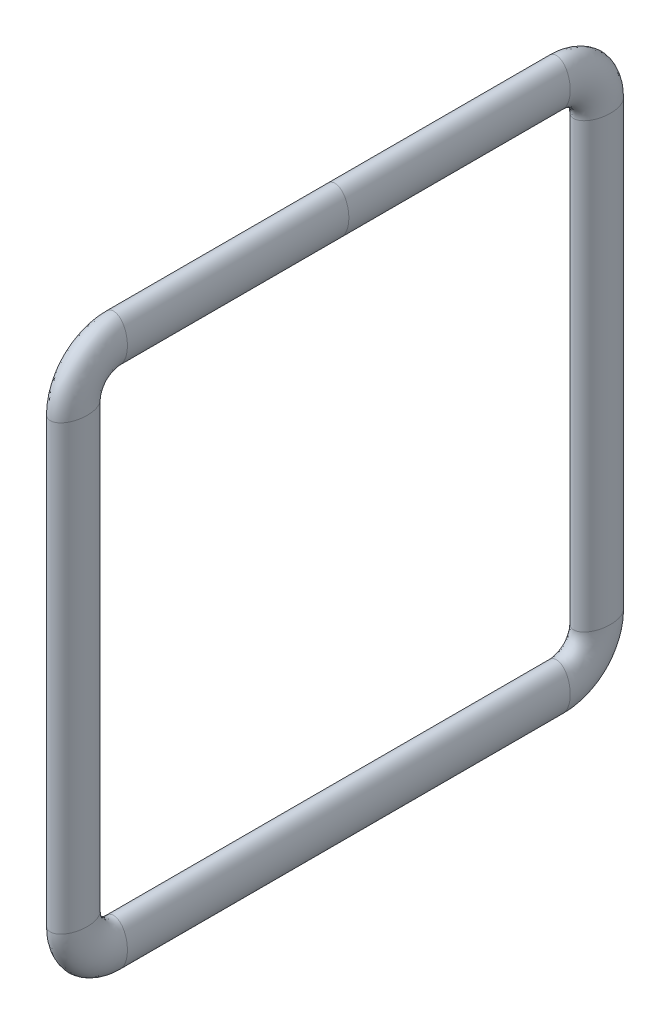
ISO-10303-21;
HEADER;
FILE_DESCRIPTION(('STEP AP214'),'2;1');
FILE_NAME('part.step','',(''),(''),'','','');
FILE_SCHEMA(('AUTOMOTIVE_DESIGN { 1 0 10303 214 1 1 1 1 }'));
ENDSEC;
DATA;
#1=APPLICATION_CONTEXT('core data for automotive mechanical design processes');
#2=APPLICATION_PROTOCOL_DEFINITION('international standard','automotive_design',2000,#1);
#3=PRODUCT_CONTEXT('',#1,'mechanical');
#4=PRODUCT('Part','Part','',(#3));
#5=PRODUCT_RELATED_PRODUCT_CATEGORY('part','',(#4));
#6=PRODUCT_DEFINITION_FORMATION('','',#4);
#7=PRODUCT_DEFINITION_CONTEXT('part definition',#1,'design');
#8=PRODUCT_DEFINITION('design','',#6,#7);
#9=PRODUCT_DEFINITION_SHAPE('','',#8);
#10=(LENGTH_UNIT() NAMED_UNIT(*) SI_UNIT(.MILLI.,.METRE.));
#11=(NAMED_UNIT(*) PLANE_ANGLE_UNIT() SI_UNIT($,.RADIAN.));
#12=(NAMED_UNIT(*) SI_UNIT($,.STERADIAN.) SOLID_ANGLE_UNIT());
#13=UNCERTAINTY_MEASURE_WITH_UNIT(LENGTH_MEASURE(1.E-05),#10,'distance_accuracy_value','');
#14=(GEOMETRIC_REPRESENTATION_CONTEXT(3) GLOBAL_UNCERTAINTY_ASSIGNED_CONTEXT((#13)) GLOBAL_UNIT_ASSIGNED_CONTEXT((#10,
#11,#12)) REPRESENTATION_CONTEXT('',''));
#15=CARTESIAN_POINT('',(0.,0.,0.));
#16=DIRECTION('',(0.,0.,1.));
#17=DIRECTION('',(1.,0.,0.));
#18=AXIS2_PLACEMENT_3D('',#15,#16,#17);
#19=CARTESIAN_POINT('',(0.,24.75,-19.25));
#20=CARTESIAN_POINT('',(0.,24.75,0.));
#21=CARTESIAN_POINT('',(-2.4,24.75,-19.25));
#22=CARTESIAN_POINT('',(-2.4,24.75,0.));
#23=CARTESIAN_POINT('',(-2.4,20.75,-19.25));
#24=CARTESIAN_POINT('',(-2.4,20.75,0.));
#25=CARTESIAN_POINT('',(0.,20.75,-19.25));
#26=CARTESIAN_POINT('',(0.,20.75,0.));
#27=CARTESIAN_POINT('',(2.4,20.75,-19.25));
#28=CARTESIAN_POINT('',(2.4,20.75,0.));
#29=CARTESIAN_POINT('',(2.4,24.75,-19.25));
#30=CARTESIAN_POINT('',(2.4,24.75,0.));
#31=CARTESIAN_POINT('',(0.,24.75,-19.25));
#32=CARTESIAN_POINT('',(0.,24.75,0.));
#33=(BOUNDED_SURFACE() B_SPLINE_SURFACE(3,1,((#19,#20),(#21,#22),(#23,#24),(#25,#26),(#27,#28),
(#29,#30),(#31,#32)),.UNSPECIFIED.,.T.,.F.,.F.) B_SPLINE_SURFACE_WITH_KNOTS((4,3,4),(2,2),(0.,
0.5,1.),(0.,1.),.UNSPECIFIED.) GEOMETRIC_REPRESENTATION_ITEM() RATIONAL_B_SPLINE_SURFACE(((1.,
1.),(0.333333333333333,0.333333333333333),(0.333333333333333,0.333333333333333),(1.,1.),
(0.333333333333333,0.333333333333333),(0.333333333333333,0.333333333333333),(1.,1.))) REPRESENTATION_ITEM('') SURFACE());
#34=CARTESIAN_POINT('',(0.,22.75,0.));
#35=DIRECTION('',(0.,0.,1.));
#36=DIRECTION('',(0.,1.,0.));
#37=AXIS2_PLACEMENT_3D('',#34,#35,#36);
#38=ELLIPSE('',#37,2.,1.2);
#39=CARTESIAN_POINT('',(0.,24.75,0.));
#40=VERTEX_POINT('',#39);
#41=EDGE_CURVE('E65',#40,#40,#38,.T.);
#42=CARTESIAN_POINT('',(0.,22.75,-19.25));
#43=DIRECTION('',(0.,0.,1.));
#44=DIRECTION('',(0.,1.,0.));
#45=AXIS2_PLACEMENT_3D('',#42,#43,#44);
#46=ELLIPSE('',#45,2.,1.2);
#47=CARTESIAN_POINT('',(0.,24.75,-19.25));
#48=VERTEX_POINT('',#47);
#49=EDGE_CURVE('E10',#48,#48,#46,.T.);
#50=ORIENTED_EDGE('',*,*,#41,.F.);
#51=EDGE_LOOP('',(#50));
#52=FACE_BOUND('',#51,.T.);
#53=ORIENTED_EDGE('',*,*,#49,.T.);
#54=EDGE_LOOP('',(#53));
#55=FACE_BOUND('',#54,.T.);
#56=ADVANCED_FACE('F32',(#52,#55),#33,.T.);
#57=CARTESIAN_POINT('',(0.,19.25,-24.75));
#58=CARTESIAN_POINT('',(0.,22.471825406948,-24.75));
#59=CARTESIAN_POINT('',(0.,24.75,-22.471825406948));
#60=CARTESIAN_POINT('',(0.,24.75,-19.25));
#61=CARTESIAN_POINT('',(-2.4,19.25,-24.75));
#62=CARTESIAN_POINT('',(-2.4,22.471825406948,-24.75));
#63=CARTESIAN_POINT('',(-2.4,24.75,-22.471825406948));
#64=CARTESIAN_POINT('',(-2.4,24.75,-19.25));
#65=CARTESIAN_POINT('',(-2.4,19.25,-20.75));
#66=CARTESIAN_POINT('',(-2.4,20.1286796564404,-20.75));
#67=CARTESIAN_POINT('',(-2.4,20.75,-20.1286796564404));
#68=CARTESIAN_POINT('',(-2.4,20.75,-19.25));
#69=CARTESIAN_POINT('',(0.,19.25,-20.75));
#70=CARTESIAN_POINT('',(0.,20.1286796564404,-20.75));
#71=CARTESIAN_POINT('',(0.,20.75,-20.1286796564404));
#72=CARTESIAN_POINT('',(0.,20.75,-19.25));
#73=CARTESIAN_POINT('',(2.4,19.25,-20.75));
#74=CARTESIAN_POINT('',(2.4,20.1286796564404,-20.75));
#75=CARTESIAN_POINT('',(2.4,20.75,-20.1286796564404));
#76=CARTESIAN_POINT('',(2.4,20.75,-19.25));
#77=CARTESIAN_POINT('',(2.4,19.25,-24.75));
#78=CARTESIAN_POINT('',(2.4,22.471825406948,-24.75));
#79=CARTESIAN_POINT('',(2.4,24.75,-22.471825406948));
#80=CARTESIAN_POINT('',(2.4,24.75,-19.25));
#81=CARTESIAN_POINT('',(0.,19.25,-24.75));
#82=CARTESIAN_POINT('',(0.,22.471825406948,-24.75));
#83=CARTESIAN_POINT('',(0.,24.75,-22.471825406948));
#84=CARTESIAN_POINT('',(0.,24.75,-19.25));
#85=(BOUNDED_SURFACE() B_SPLINE_SURFACE(3,3,((#57,#58,#59,#60),(#61,#62,#63,#64),(#65,#66,#67,
#68),(#69,#70,#71,#72),(#73,#74,#75,#76),(#77,#78,#79,#80),(#81,#82,#83,#84)),.UNSPECIFIED.,.T.,
.F.,.F.) B_SPLINE_SURFACE_WITH_KNOTS((4,3,4),(4,4),(0.,0.5,1.),(0.,1.),
.UNSPECIFIED.) GEOMETRIC_REPRESENTATION_ITEM() RATIONAL_B_SPLINE_SURFACE(((1.,0.804737854124365,
0.804737854124365,1.),(0.333333333333333,0.268245951374788,0.268245951374788,0.333333333333333),
(0.333333333333333,0.268245951374788,0.268245951374788,0.333333333333333),(1.,0.804737854124365,
0.804737854124365,1.),(0.333333333333333,0.268245951374788,0.268245951374788,0.333333333333333),
(0.333333333333333,0.268245951374788,0.268245951374788,0.333333333333333),(1.,0.804737854124365,
0.804737854124365,1.))) REPRESENTATION_ITEM('') SURFACE());
#86=CARTESIAN_POINT('',(0.,19.25,-22.75));
#87=DIRECTION('',(0.,1.,0.));
#88=DIRECTION('',(0.,0.,-1.));
#89=AXIS2_PLACEMENT_3D('',#86,#87,#88);
#90=ELLIPSE('',#89,2.,1.2);
#91=CARTESIAN_POINT('',(0.,19.25,-24.75));
#92=VERTEX_POINT('',#91);
#93=EDGE_CURVE('E40',#92,#92,#90,.T.);
#94=ORIENTED_EDGE('',*,*,#49,.F.);
#95=EDGE_LOOP('',(#94));
#96=FACE_BOUND('',#95,.T.);
#97=ORIENTED_EDGE('',*,*,#93,.T.);
#98=EDGE_LOOP('',(#97));
#99=FACE_BOUND('',#98,.T.);
#100=ADVANCED_FACE('F72',(#96,#99),#85,.T.);
#101=CARTESIAN_POINT('',(0.,-19.25,-24.75));
#102=CARTESIAN_POINT('',(0.,19.25,-24.75));
#103=CARTESIAN_POINT('',(-2.4,-19.25,-24.75));
#104=CARTESIAN_POINT('',(-2.4,19.25,-24.75));
#105=CARTESIAN_POINT('',(-2.4,-19.25,-20.75));
#106=CARTESIAN_POINT('',(-2.4,19.25,-20.75));
#107=CARTESIAN_POINT('',(0.,-19.25,-20.75));
#108=CARTESIAN_POINT('',(0.,19.25,-20.75));
#109=CARTESIAN_POINT('',(2.4,-19.25,-20.75));
#110=CARTESIAN_POINT('',(2.4,19.25,-20.75));
#111=CARTESIAN_POINT('',(2.4,-19.25,-24.75));
#112=CARTESIAN_POINT('',(2.4,19.25,-24.75));
#113=CARTESIAN_POINT('',(0.,-19.25,-24.75));
#114=CARTESIAN_POINT('',(0.,19.25,-24.75));
#115=(BOUNDED_SURFACE() B_SPLINE_SURFACE(3,1,((#101,#102),(#103,#104),(#105,#106),(#107,#108),
(#109,#110),(#111,#112),(#113,#114)),.UNSPECIFIED.,.T.,.F.,.F.) B_SPLINE_SURFACE_WITH_KNOTS((4,
3,4),(2,2),(0.,0.5,1.),(0.,1.),
.UNSPECIFIED.) GEOMETRIC_REPRESENTATION_ITEM() RATIONAL_B_SPLINE_SURFACE(((1.,1.),
(0.333333333333333,0.333333333333333),(0.333333333333333,0.333333333333333),(1.,1.),
(0.333333333333333,0.333333333333333),(0.333333333333333,0.333333333333333),(1.,1.))) REPRESENTATION_ITEM('') SURFACE());
#116=CARTESIAN_POINT('',(0.,-19.25,-22.75));
#117=DIRECTION('',(0.,1.,0.));
#118=DIRECTION('',(0.,0.,-1.));
#119=AXIS2_PLACEMENT_3D('',#116,#117,#118);
#120=ELLIPSE('',#119,2.,1.2);
#121=CARTESIAN_POINT('',(0.,-19.25,-24.75));
#122=VERTEX_POINT('',#121);
#123=EDGE_CURVE('E44',#122,#122,#120,.T.);
#124=ORIENTED_EDGE('',*,*,#93,.F.);
#125=EDGE_LOOP('',(#124));
#126=FACE_BOUND('',#125,.T.);
#127=ORIENTED_EDGE('',*,*,#123,.T.);
#128=EDGE_LOOP('',(#127));
#129=FACE_BOUND('',#128,.T.);
#130=ADVANCED_FACE('F76',(#126,#129),#115,.T.);
#131=CARTESIAN_POINT('',(0.,-24.75,-19.25));
#132=CARTESIAN_POINT('',(0.,-24.75,-22.471825406948));
#133=CARTESIAN_POINT('',(0.,-22.471825406948,-24.75));
#134=CARTESIAN_POINT('',(0.,-19.25,-24.75));
#135=CARTESIAN_POINT('',(-2.4,-24.75,-19.25));
#136=CARTESIAN_POINT('',(-2.4,-24.75,-22.471825406948));
#137=CARTESIAN_POINT('',(-2.4,-22.471825406948,-24.75));
#138=CARTESIAN_POINT('',(-2.4,-19.25,-24.75));
#139=CARTESIAN_POINT('',(-2.4,-20.75,-19.25));
#140=CARTESIAN_POINT('',(-2.4,-20.75,-20.1286796564404));
#141=CARTESIAN_POINT('',(-2.4,-20.1286796564404,-20.75));
#142=CARTESIAN_POINT('',(-2.4,-19.25,-20.75));
#143=CARTESIAN_POINT('',(0.,-20.75,-19.25));
#144=CARTESIAN_POINT('',(0.,-20.75,-20.1286796564404));
#145=CARTESIAN_POINT('',(0.,-20.1286796564404,-20.75));
#146=CARTESIAN_POINT('',(0.,-19.25,-20.75));
#147=CARTESIAN_POINT('',(2.4,-20.75,-19.25));
#148=CARTESIAN_POINT('',(2.4,-20.75,-20.1286796564404));
#149=CARTESIAN_POINT('',(2.4,-20.1286796564404,-20.75));
#150=CARTESIAN_POINT('',(2.4,-19.25,-20.75));
#151=CARTESIAN_POINT('',(2.4,-24.75,-19.25));
#152=CARTESIAN_POINT('',(2.4,-24.75,-22.471825406948));
#153=CARTESIAN_POINT('',(2.4,-22.471825406948,-24.75));
#154=CARTESIAN_POINT('',(2.4,-19.25,-24.75));
#155=CARTESIAN_POINT('',(0.,-24.75,-19.25));
#156=CARTESIAN_POINT('',(0.,-24.75,-22.471825406948));
#157=CARTESIAN_POINT('',(0.,-22.471825406948,-24.75));
#158=CARTESIAN_POINT('',(0.,-19.25,-24.75));
#159=(BOUNDED_SURFACE() B_SPLINE_SURFACE(3,3,((#131,#132,#133,#134),(#135,#136,#137,#138),(#139,
#140,#141,#142),(#143,#144,#145,#146),(#147,#148,#149,#150),(#151,#152,#153,#154),(#155,#156,
#157,#158)),.UNSPECIFIED.,.T.,.F.,.F.) B_SPLINE_SURFACE_WITH_KNOTS((4,3,4),(4,4),(0.,0.5,1.),
(0.,1.),.UNSPECIFIED.) GEOMETRIC_REPRESENTATION_ITEM() RATIONAL_B_SPLINE_SURFACE(((1.,
0.804737854124365,0.804737854124365,1.),(0.333333333333333,0.268245951374789,0.268245951374789,
0.333333333333333),(0.333333333333333,0.268245951374789,0.268245951374789,0.333333333333333),
(1.,0.804737854124365,0.804737854124365,1.),(0.333333333333333,0.268245951374789,
0.268245951374789,0.333333333333333),(0.333333333333333,0.268245951374789,0.268245951374789,
0.333333333333333),(1.,0.804737854124365,0.804737854124365,1.))) REPRESENTATION_ITEM('') SURFACE());
#160=CARTESIAN_POINT('',(0.,-22.75,-19.25));
#161=DIRECTION('',(0.,0.,-1.));
#162=DIRECTION('',(0.,-1.,0.));
#163=AXIS2_PLACEMENT_3D('',#160,#161,#162);
#164=ELLIPSE('',#163,2.,1.2);
#165=CARTESIAN_POINT('',(0.,-24.75,-19.25));
#166=VERTEX_POINT('',#165);
#167=EDGE_CURVE('E48',#166,#166,#164,.T.);
#168=ORIENTED_EDGE('',*,*,#123,.F.);
#169=EDGE_LOOP('',(#168));
#170=FACE_BOUND('',#169,.T.);
#171=ORIENTED_EDGE('',*,*,#167,.T.);
#172=EDGE_LOOP('',(#171));
#173=FACE_BOUND('',#172,.T.);
#174=ADVANCED_FACE('F81',(#170,#173),#159,.T.);
#175=CARTESIAN_POINT('',(0.,-24.75,19.25));
#176=CARTESIAN_POINT('',(0.,-24.75,-19.25));
#177=CARTESIAN_POINT('',(-2.4,-24.75,19.25));
#178=CARTESIAN_POINT('',(-2.4,-24.75,-19.25));
#179=CARTESIAN_POINT('',(-2.4,-20.75,19.25));
#180=CARTESIAN_POINT('',(-2.4,-20.75,-19.25));
#181=CARTESIAN_POINT('',(0.,-20.75,19.25));
#182=CARTESIAN_POINT('',(0.,-20.75,-19.25));
#183=CARTESIAN_POINT('',(2.4,-20.75,19.25));
#184=CARTESIAN_POINT('',(2.4,-20.75,-19.25));
#185=CARTESIAN_POINT('',(2.4,-24.75,19.25));
#186=CARTESIAN_POINT('',(2.4,-24.75,-19.25));
#187=CARTESIAN_POINT('',(0.,-24.75,19.25));
#188=CARTESIAN_POINT('',(0.,-24.75,-19.25));
#189=(BOUNDED_SURFACE() B_SPLINE_SURFACE(3,1,((#175,#176),(#177,#178),(#179,#180),(#181,#182),
(#183,#184),(#185,#186),(#187,#188)),.UNSPECIFIED.,.T.,.F.,.F.) B_SPLINE_SURFACE_WITH_KNOTS((4,
3,4),(2,2),(0.,0.5,1.),(0.,1.),
.UNSPECIFIED.) GEOMETRIC_REPRESENTATION_ITEM() RATIONAL_B_SPLINE_SURFACE(((1.,1.),
(0.333333333333333,0.333333333333333),(0.333333333333333,0.333333333333333),(1.,1.),
(0.333333333333333,0.333333333333333),(0.333333333333333,0.333333333333333),(1.,1.))) REPRESENTATION_ITEM('') SURFACE());
#190=CARTESIAN_POINT('',(0.,-22.75,19.25));
#191=DIRECTION('',(0.,0.,-1.));
#192=DIRECTION('',(0.,-1.,0.));
#193=AXIS2_PLACEMENT_3D('',#190,#191,#192);
#194=ELLIPSE('',#193,2.,1.2);
#195=CARTESIAN_POINT('',(0.,-24.75,19.25));
#196=VERTEX_POINT('',#195);
#197=EDGE_CURVE('E53',#196,#196,#194,.T.);
#198=ORIENTED_EDGE('',*,*,#167,.F.);
#199=EDGE_LOOP('',(#198));
#200=FACE_BOUND('',#199,.T.);
#201=ORIENTED_EDGE('',*,*,#197,.T.);
#202=EDGE_LOOP('',(#201));
#203=FACE_BOUND('',#202,.T.);
#204=ADVANCED_FACE('F103',(#200,#203),#189,.T.);
#205=CARTESIAN_POINT('',(0.,-19.25,24.75));
#206=CARTESIAN_POINT('',(0.,-22.471825406948,24.75));
#207=CARTESIAN_POINT('',(0.,-24.75,22.471825406948));
#208=CARTESIAN_POINT('',(0.,-24.75,19.25));
#209=CARTESIAN_POINT('',(-2.4,-19.25,24.75));
#210=CARTESIAN_POINT('',(-2.4,-22.471825406948,24.75));
#211=CARTESIAN_POINT('',(-2.4,-24.75,22.471825406948));
#212=CARTESIAN_POINT('',(-2.4,-24.75,19.25));
#213=CARTESIAN_POINT('',(-2.4,-19.25,20.75));
#214=CARTESIAN_POINT('',(-2.4,-20.1286796564404,20.75));
#215=CARTESIAN_POINT('',(-2.4,-20.75,20.1286796564404));
#216=CARTESIAN_POINT('',(-2.4,-20.75,19.25));
#217=CARTESIAN_POINT('',(0.,-19.25,20.75));
#218=CARTESIAN_POINT('',(0.,-20.1286796564404,20.75));
#219=CARTESIAN_POINT('',(0.,-20.75,20.1286796564404));
#220=CARTESIAN_POINT('',(0.,-20.75,19.25));
#221=CARTESIAN_POINT('',(2.4,-19.25,20.75));
#222=CARTESIAN_POINT('',(2.4,-20.1286796564404,20.75));
#223=CARTESIAN_POINT('',(2.4,-20.75,20.1286796564404));
#224=CARTESIAN_POINT('',(2.4,-20.75,19.25));
#225=CARTESIAN_POINT('',(2.4,-19.25,24.75));
#226=CARTESIAN_POINT('',(2.4,-22.471825406948,24.75));
#227=CARTESIAN_POINT('',(2.4,-24.75,22.471825406948));
#228=CARTESIAN_POINT('',(2.4,-24.75,19.25));
#229=CARTESIAN_POINT('',(0.,-19.25,24.75));
#230=CARTESIAN_POINT('',(0.,-22.471825406948,24.75));
#231=CARTESIAN_POINT('',(0.,-24.75,22.471825406948));
#232=CARTESIAN_POINT('',(0.,-24.75,19.25));
#233=(BOUNDED_SURFACE() B_SPLINE_SURFACE(3,3,((#205,#206,#207,#208),(#209,#210,#211,#212),(#213,
#214,#215,#216),(#217,#218,#219,#220),(#221,#222,#223,#224),(#225,#226,#227,#228),(#229,#230,
#231,#232)),.UNSPECIFIED.,.T.,.F.,.F.) B_SPLINE_SURFACE_WITH_KNOTS((4,3,4),(4,4),(0.,0.5,1.),
(0.,1.),.UNSPECIFIED.) GEOMETRIC_REPRESENTATION_ITEM() RATIONAL_B_SPLINE_SURFACE(((1.,
0.804737854124364,0.804737854124364,1.),(0.333333333333333,0.268245951374788,0.268245951374788,
0.333333333333333),(0.333333333333333,0.268245951374788,0.268245951374788,0.333333333333333),
(1.,0.804737854124364,0.804737854124364,1.),(0.333333333333333,0.268245951374788,
0.268245951374788,0.333333333333333),(0.333333333333333,0.268245951374788,0.268245951374788,
0.333333333333333),(1.,0.804737854124364,0.804737854124364,1.))) REPRESENTATION_ITEM('') SURFACE());
#234=CARTESIAN_POINT('',(0.,-19.25,22.75));
#235=DIRECTION('',(0.,-1.,0.));
#236=DIRECTION('',(0.,0.,1.));
#237=AXIS2_PLACEMENT_3D('',#234,#235,#236);
#238=ELLIPSE('',#237,2.,1.2);
#239=CARTESIAN_POINT('',(0.,-19.25,24.75));
#240=VERTEX_POINT('',#239);
#241=EDGE_CURVE('E56',#240,#240,#238,.T.);
#242=ORIENTED_EDGE('',*,*,#197,.F.);
#243=EDGE_LOOP('',(#242));
#244=FACE_BOUND('',#243,.T.);
#245=ORIENTED_EDGE('',*,*,#241,.T.);
#246=EDGE_LOOP('',(#245));
#247=FACE_BOUND('',#246,.T.);
#248=ADVANCED_FACE('F114',(#244,#247),#233,.T.);
#249=CARTESIAN_POINT('',(0.,19.25,24.75));
#250=CARTESIAN_POINT('',(0.,-19.25,24.75));
#251=CARTESIAN_POINT('',(-2.4,19.25,24.75));
#252=CARTESIAN_POINT('',(-2.4,-19.25,24.75));
#253=CARTESIAN_POINT('',(-2.4,19.25,20.75));
#254=CARTESIAN_POINT('',(-2.4,-19.25,20.75));
#255=CARTESIAN_POINT('',(0.,19.25,20.75));
#256=CARTESIAN_POINT('',(0.,-19.25,20.75));
#257=CARTESIAN_POINT('',(2.4,19.25,20.75));
#258=CARTESIAN_POINT('',(2.4,-19.25,20.75));
#259=CARTESIAN_POINT('',(2.4,19.25,24.75));
#260=CARTESIAN_POINT('',(2.4,-19.25,24.75));
#261=CARTESIAN_POINT('',(0.,19.25,24.75));
#262=CARTESIAN_POINT('',(0.,-19.25,24.75));
#263=(BOUNDED_SURFACE() B_SPLINE_SURFACE(3,1,((#249,#250),(#251,#252),(#253,#254),(#255,#256),
(#257,#258),(#259,#260),(#261,#262)),.UNSPECIFIED.,.T.,.F.,.F.) B_SPLINE_SURFACE_WITH_KNOTS((4,
3,4),(2,2),(0.,0.5,1.),(0.,1.),
.UNSPECIFIED.) GEOMETRIC_REPRESENTATION_ITEM() RATIONAL_B_SPLINE_SURFACE(((1.,1.),
(0.333333333333333,0.333333333333333),(0.333333333333333,0.333333333333333),(1.,1.),
(0.333333333333333,0.333333333333333),(0.333333333333333,0.333333333333333),(1.,1.))) REPRESENTATION_ITEM('') SURFACE());
#264=CARTESIAN_POINT('',(0.,19.25,22.75));
#265=DIRECTION('',(0.,-1.,0.));
#266=DIRECTION('',(0.,0.,1.));
#267=AXIS2_PLACEMENT_3D('',#264,#265,#266);
#268=ELLIPSE('',#267,2.,1.2);
#269=CARTESIAN_POINT('',(0.,19.25,24.75));
#270=VERTEX_POINT('',#269);
#271=EDGE_CURVE('E59',#270,#270,#268,.T.);
#272=ORIENTED_EDGE('',*,*,#241,.F.);
#273=EDGE_LOOP('',(#272));
#274=FACE_BOUND('',#273,.T.);
#275=ORIENTED_EDGE('',*,*,#271,.T.);
#276=EDGE_LOOP('',(#275));
#277=FACE_BOUND('',#276,.T.);
#278=ADVANCED_FACE('F125',(#274,#277),#263,.T.);
#279=CARTESIAN_POINT('',(0.,24.75,19.25));
#280=CARTESIAN_POINT('',(0.,24.75,22.4718254069479));
#281=CARTESIAN_POINT('',(0.,22.471825406948,24.75));
#282=CARTESIAN_POINT('',(0.,19.25,24.75));
#283=CARTESIAN_POINT('',(-2.4,24.75,19.25));
#284=CARTESIAN_POINT('',(-2.4,24.75,22.4718254069479));
#285=CARTESIAN_POINT('',(-2.4,22.471825406948,24.75));
#286=CARTESIAN_POINT('',(-2.4,19.25,24.75));
#287=CARTESIAN_POINT('',(-2.4,20.75,19.25));
#288=CARTESIAN_POINT('',(-2.4,20.75,20.1286796564403));
#289=CARTESIAN_POINT('',(-2.4,20.1286796564404,20.75));
#290=CARTESIAN_POINT('',(-2.4,19.25,20.75));
#291=CARTESIAN_POINT('',(0.,20.75,19.25));
#292=CARTESIAN_POINT('',(0.,20.75,20.1286796564403));
#293=CARTESIAN_POINT('',(0.,20.1286796564404,20.75));
#294=CARTESIAN_POINT('',(0.,19.25,20.75));
#295=CARTESIAN_POINT('',(2.4,20.75,19.25));
#296=CARTESIAN_POINT('',(2.4,20.75,20.1286796564403));
#297=CARTESIAN_POINT('',(2.4,20.1286796564404,20.75));
#298=CARTESIAN_POINT('',(2.4,19.25,20.75));
#299=CARTESIAN_POINT('',(2.4,24.75,19.25));
#300=CARTESIAN_POINT('',(2.4,24.75,22.4718254069479));
#301=CARTESIAN_POINT('',(2.4,22.471825406948,24.75));
#302=CARTESIAN_POINT('',(2.4,19.25,24.75));
#303=CARTESIAN_POINT('',(0.,24.75,19.25));
#304=CARTESIAN_POINT('',(0.,24.75,22.4718254069479));
#305=CARTESIAN_POINT('',(0.,22.471825406948,24.75));
#306=CARTESIAN_POINT('',(0.,19.25,24.75));
#307=(BOUNDED_SURFACE() B_SPLINE_SURFACE(3,3,((#279,#280,#281,#282),(#283,#284,#285,#286),(#287,
#288,#289,#290),(#291,#292,#293,#294),(#295,#296,#297,#298),(#299,#300,#301,#302),(#303,#304,
#305,#306)),.UNSPECIFIED.,.T.,.F.,.F.) B_SPLINE_SURFACE_WITH_KNOTS((4,3,4),(4,4),(0.,0.5,1.),
(0.,1.),.UNSPECIFIED.) GEOMETRIC_REPRESENTATION_ITEM() RATIONAL_B_SPLINE_SURFACE(((1.,
0.804737854124365,0.804737854124365,1.),(0.333333333333333,0.268245951374788,0.268245951374788,
0.333333333333333),(0.333333333333333,0.268245951374788,0.268245951374788,0.333333333333333),
(1.,0.804737854124365,0.804737854124365,1.),(0.333333333333333,0.268245951374788,
0.268245951374788,0.333333333333333),(0.333333333333333,0.268245951374788,0.268245951374788,
0.333333333333333),(1.,0.804737854124365,0.804737854124365,1.))) REPRESENTATION_ITEM('') SURFACE());
#308=CARTESIAN_POINT('',(0.,22.75,19.25));
#309=DIRECTION('',(0.,0.,1.));
#310=DIRECTION('',(0.,1.,0.));
#311=AXIS2_PLACEMENT_3D('',#308,#309,#310);
#312=ELLIPSE('',#311,2.,1.2);
#313=CARTESIAN_POINT('',(0.,24.75,19.25));
#314=VERTEX_POINT('',#313);
#315=EDGE_CURVE('E62',#314,#314,#312,.T.);
#316=ORIENTED_EDGE('',*,*,#271,.F.);
#317=EDGE_LOOP('',(#316));
#318=FACE_BOUND('',#317,.T.);
#319=ORIENTED_EDGE('',*,*,#315,.T.);
#320=EDGE_LOOP('',(#319));
#321=FACE_BOUND('',#320,.T.);
#322=ADVANCED_FACE('F136',(#318,#321),#307,.T.);
#323=CARTESIAN_POINT('',(0.,24.75,0.));
#324=CARTESIAN_POINT('',(0.,24.75,19.25));
#325=CARTESIAN_POINT('',(-2.4,24.75,0.));
#326=CARTESIAN_POINT('',(-2.4,24.75,19.25));
#327=CARTESIAN_POINT('',(-2.4,20.75,0.));
#328=CARTESIAN_POINT('',(-2.4,20.75,19.25));
#329=CARTESIAN_POINT('',(0.,20.75,0.));
#330=CARTESIAN_POINT('',(0.,20.75,19.25));
#331=CARTESIAN_POINT('',(2.4,20.75,0.));
#332=CARTESIAN_POINT('',(2.4,20.75,19.25));
#333=CARTESIAN_POINT('',(2.4,24.75,0.));
#334=CARTESIAN_POINT('',(2.4,24.75,19.25));
#335=CARTESIAN_POINT('',(0.,24.75,0.));
#336=CARTESIAN_POINT('',(0.,24.75,19.25));
#337=(BOUNDED_SURFACE() B_SPLINE_SURFACE(3,1,((#323,#324),(#325,#326),(#327,#328),(#329,#330),
(#331,#332),(#333,#334),(#335,#336)),.UNSPECIFIED.,.T.,.F.,.F.) B_SPLINE_SURFACE_WITH_KNOTS((4,
3,4),(2,2),(0.,0.5,1.),(0.,1.),
.UNSPECIFIED.) GEOMETRIC_REPRESENTATION_ITEM() RATIONAL_B_SPLINE_SURFACE(((1.,1.),
(0.333333333333333,0.333333333333333),(0.333333333333333,0.333333333333333),(1.,1.),
(0.333333333333333,0.333333333333333),(0.333333333333333,0.333333333333333),(1.,1.))) REPRESENTATION_ITEM('') SURFACE());
#338=ORIENTED_EDGE('',*,*,#315,.F.);
#339=EDGE_LOOP('',(#338));
#340=FACE_BOUND('',#339,.T.);
#341=ORIENTED_EDGE('',*,*,#41,.T.);
#342=EDGE_LOOP('',(#341));
#343=FACE_BOUND('',#342,.T.);
#344=ADVANCED_FACE('F69',(#340,#343),#337,.T.);
#345=CLOSED_SHELL('',(#56,#100,#130,#174,#204,#248,#278,#322,#344));
#346=MANIFOLD_SOLID_BREP('B2',#345);
#347=ADVANCED_BREP_SHAPE_REPRESENTATION('',(#18,#346),#14);
#348=SHAPE_DEFINITION_REPRESENTATION(#9,#347);
ENDSEC;
END-ISO-10303-21;
